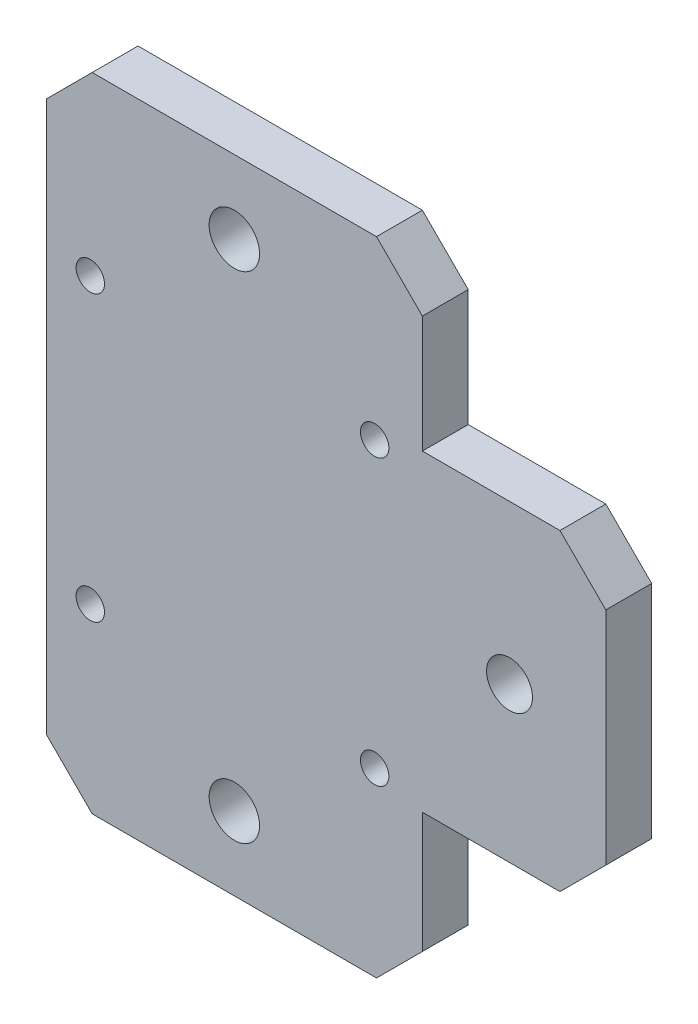
ISO-10303-21;
HEADER;
FILE_DESCRIPTION(('STEP AP214'),'2;1');
FILE_NAME('part.step','',(''),(''),'','','');
FILE_SCHEMA(('AUTOMOTIVE_DESIGN { 1 0 10303 214 1 1 1 1 }'));
ENDSEC;
DATA;
#1=APPLICATION_CONTEXT('core data for automotive mechanical design processes');
#2=APPLICATION_PROTOCOL_DEFINITION('international standard','automotive_design',2000,#1);
#3=PRODUCT_CONTEXT('',#1,'mechanical');
#4=PRODUCT('Part','Part','',(#3));
#5=PRODUCT_RELATED_PRODUCT_CATEGORY('part','',(#4));
#6=PRODUCT_DEFINITION_FORMATION('','',#4);
#7=PRODUCT_DEFINITION_CONTEXT('part definition',#1,'design');
#8=PRODUCT_DEFINITION('design','',#6,#7);
#9=PRODUCT_DEFINITION_SHAPE('','',#8);
#10=(LENGTH_UNIT() NAMED_UNIT(*) SI_UNIT(.MILLI.,.METRE.));
#11=(NAMED_UNIT(*) PLANE_ANGLE_UNIT() SI_UNIT($,.RADIAN.));
#12=(NAMED_UNIT(*) SI_UNIT($,.STERADIAN.) SOLID_ANGLE_UNIT());
#13=UNCERTAINTY_MEASURE_WITH_UNIT(LENGTH_MEASURE(1.E-05),#10,'distance_accuracy_value','');
#14=(GEOMETRIC_REPRESENTATION_CONTEXT(3) GLOBAL_UNCERTAINTY_ASSIGNED_CONTEXT((#13)) GLOBAL_UNIT_ASSIGNED_CONTEXT((#10,
#11,#12)) REPRESENTATION_CONTEXT('',''));
#15=CARTESIAN_POINT('',(0.,0.,0.));
#16=DIRECTION('',(0.,0.,1.));
#17=DIRECTION('',(1.,0.,0.));
#18=AXIS2_PLACEMENT_3D('',#15,#16,#17);
#19=CARTESIAN_POINT('',(20.5,-35.,5.));
#20=DIRECTION('',(-1.,0.,0.));
#21=DIRECTION('',(0.,0.,1.));
#22=AXIS2_PLACEMENT_3D('',#19,#20,#21);
#23=PLANE('',#22);
#24=DIRECTION('',(0.,0.,1.));
#25=VECTOR('',#24,1.);
#26=CARTESIAN_POINT('',(20.5,17.2547781569966,0.));
#27=LINE('',#26,#25);
#28=CARTESIAN_POINT('',(20.5,17.2547781569966,0.));
#29=VERTEX_POINT('',#28);
#30=CARTESIAN_POINT('',(20.5,17.2547781569966,5.));
#31=VERTEX_POINT('',#30);
#32=EDGE_CURVE('E149',#29,#31,#27,.T.);
#33=ORIENTED_EDGE('',*,*,#32,.F.);
#34=DIRECTION('',(0.,1.,0.));
#35=VECTOR('',#34,1.);
#36=CARTESIAN_POINT('',(20.5,-35.,0.));
#37=LINE('',#36,#35);
#38=CARTESIAN_POINT('',(20.5,30.,0.));
#39=VERTEX_POINT('',#38);
#40=EDGE_CURVE('E165',#29,#39,#37,.T.);
#41=ORIENTED_EDGE('',*,*,#40,.T.);
#42=DIRECTION('',(0.,0.,1.));
#43=VECTOR('',#42,1.);
#44=CARTESIAN_POINT('',(20.5,30.,5.));
#45=LINE('',#44,#43);
#46=CARTESIAN_POINT('',(20.5,30.,5.));
#47=VERTEX_POINT('',#46);
#48=EDGE_CURVE('E202',#39,#47,#45,.T.);
#49=ORIENTED_EDGE('',*,*,#48,.T.);
#50=DIRECTION('',(0.,1.,0.));
#51=VECTOR('',#50,1.);
#52=CARTESIAN_POINT('',(20.5,-35.,5.));
#53=LINE('',#52,#51);
#54=EDGE_CURVE('E289',#31,#47,#53,.T.);
#55=ORIENTED_EDGE('',*,*,#54,.F.);
#56=EDGE_LOOP('',(#33,#41,#49,#55));
#57=FACE_BOUND('',#56,.T.);
#58=ADVANCED_FACE('F36',(#57),#23,.F.);
#59=CARTESIAN_POINT('',(0.,0.,5.));
#60=DIRECTION('',(0.,0.,1.));
#61=DIRECTION('',(1.,0.,0.));
#62=AXIS2_PLACEMENT_3D('',#59,#60,#61);
#63=PLANE('',#62);
#64=CARTESIAN_POINT('',(0.,-27.,5.));
#65=DIRECTION('',(0.,0.,1.));
#66=DIRECTION('',(1.,0.,0.));
#67=AXIS2_PLACEMENT_3D('',#64,#65,#66);
#68=CIRCLE('',#67,2.75);
#69=CARTESIAN_POINT('',(2.75,-27.,5.));
#70=VERTEX_POINT('',#69);
#71=EDGE_CURVE('E254',#70,#70,#68,.T.);
#72=ORIENTED_EDGE('',*,*,#71,.F.);
#73=EDGE_LOOP('',(#72));
#74=FACE_BOUND('',#73,.T.);
#75=CARTESIAN_POINT('',(15.2952218430034,15.7047781569966,5.));
#76=DIRECTION('',(0.,0.,1.));
#77=DIRECTION('',(1.,0.,0.));
#78=AXIS2_PLACEMENT_3D('',#75,#76,#77);
#79=CIRCLE('',#78,1.55000000000004);
#80=CARTESIAN_POINT('',(16.8452218430034,15.7047781569966,5.));
#81=VERTEX_POINT('',#80);
#82=EDGE_CURVE('E266',#81,#81,#79,.T.);
#83=ORIENTED_EDGE('',*,*,#82,.F.);
#84=EDGE_LOOP('',(#83));
#85=FACE_BOUND('',#84,.T.);
#86=CARTESIAN_POINT('',(-15.7047781569966,-15.2952218430034,5.));
#87=DIRECTION('',(0.,0.,1.));
#88=DIRECTION('',(1.,0.,0.));
#89=AXIS2_PLACEMENT_3D('',#86,#87,#88);
#90=CIRCLE('',#89,1.55000000000002);
#91=CARTESIAN_POINT('',(-14.1547781569966,-15.2952218430034,5.));
#92=VERTEX_POINT('',#91);
#93=EDGE_CURVE('E278',#92,#92,#90,.T.);
#94=ORIENTED_EDGE('',*,*,#93,.F.);
#95=EDGE_LOOP('',(#94));
#96=FACE_BOUND('',#95,.T.);
#97=DIRECTION('',(1.,0.,0.));
#98=VECTOR('',#97,1.);
#99=CARTESIAN_POINT('',(20.5,-16.8452218430034,5.));
#100=LINE('',#99,#98);
#101=CARTESIAN_POINT('',(20.5,-16.8452218430034,5.));
#102=VERTEX_POINT('',#101);
#103=CARTESIAN_POINT('',(35.5,-16.8452218430034,5.));
#104=VERTEX_POINT('',#103);
#105=EDGE_CURVE('E144',#102,#104,#100,.T.);
#106=ORIENTED_EDGE('',*,*,#105,.T.);
#107=DIRECTION('',(-0.707106781186546,-0.707106781186549,0.));
#108=VECTOR('',#107,1.);
#109=CARTESIAN_POINT('',(26.1726109215018,-26.1726109215017,5.));
#110=LINE('',#109,#108);
#111=CARTESIAN_POINT('',(40.5,-11.8452218430034,5.));
#112=VERTEX_POINT('',#111);
#113=EDGE_CURVE('E215',#104,#112,#110,.F.);
#114=ORIENTED_EDGE('',*,*,#113,.T.);
#115=DIRECTION('',(0.,1.,0.));
#116=VECTOR('',#115,1.);
#117=CARTESIAN_POINT('',(40.5,17.2547781569966,5.));
#118=LINE('',#117,#116);
#119=CARTESIAN_POINT('',(40.5,12.2547781569966,5.));
#120=VERTEX_POINT('',#119);
#121=EDGE_CURVE('E228',#112,#120,#118,.T.);
#122=ORIENTED_EDGE('',*,*,#121,.T.);
#123=DIRECTION('',(0.707106781186549,-0.707106781186546,0.));
#124=VECTOR('',#123,1.);
#125=CARTESIAN_POINT('',(26.3773890784982,26.3773890784984,5.));
#126=LINE('',#125,#124);
#127=CARTESIAN_POINT('',(35.5,17.2547781569966,5.));
#128=VERTEX_POINT('',#127);
#129=EDGE_CURVE('E213',#120,#128,#126,.F.);
#130=ORIENTED_EDGE('',*,*,#129,.T.);
#131=DIRECTION('',(-1.,0.,0.));
#132=VECTOR('',#131,1.);
#133=CARTESIAN_POINT('',(20.5,17.2547781569966,5.));
#134=LINE('',#133,#132);
#135=EDGE_CURVE('E158',#128,#31,#134,.T.);
#136=ORIENTED_EDGE('',*,*,#135,.T.);
#137=ORIENTED_EDGE('',*,*,#54,.T.);
#138=DIRECTION('',(0.707106781186545,-0.70710678118655,0.));
#139=VECTOR('',#138,1.);
#140=CARTESIAN_POINT('',(25.2500000000001,25.2499999999999,5.));
#141=LINE('',#140,#139);
#142=CARTESIAN_POINT('',(15.5,35.,5.));
#143=VERTEX_POINT('',#142);
#144=EDGE_CURVE('E194',#47,#143,#141,.F.);
#145=ORIENTED_EDGE('',*,*,#144,.T.);
#146=DIRECTION('',(-1.,0.,0.));
#147=VECTOR('',#146,1.);
#148=CARTESIAN_POINT('',(20.5,35.,5.));
#149=LINE('',#148,#147);
#150=CARTESIAN_POINT('',(-15.5,35.,5.));
#151=VERTEX_POINT('',#150);
#152=EDGE_CURVE('E177',#143,#151,#149,.T.);
#153=ORIENTED_EDGE('',*,*,#152,.T.);
#154=DIRECTION('',(0.707106781186548,0.707106781186548,0.));
#155=VECTOR('',#154,1.);
#156=CARTESIAN_POINT('',(-25.25,25.25,5.));
#157=LINE('',#156,#155);
#158=CARTESIAN_POINT('',(-20.5,30.,5.));
#159=VERTEX_POINT('',#158);
#160=EDGE_CURVE('E196',#151,#159,#157,.F.);
#161=ORIENTED_EDGE('',*,*,#160,.T.);
#162=DIRECTION('',(0.,-1.,0.));
#163=VECTOR('',#162,1.);
#164=CARTESIAN_POINT('',(-20.5,-35.,5.));
#165=LINE('',#164,#163);
#166=CARTESIAN_POINT('',(-20.5,-30.,5.));
#167=VERTEX_POINT('',#166);
#168=EDGE_CURVE('E168',#159,#167,#165,.T.);
#169=ORIENTED_EDGE('',*,*,#168,.T.);
#170=DIRECTION('',(-0.707106781186546,0.707106781186549,0.));
#171=VECTOR('',#170,1.);
#172=CARTESIAN_POINT('',(-25.25,-25.2499999999999,5.));
#173=LINE('',#172,#171);
#174=CARTESIAN_POINT('',(-15.5,-35.,5.));
#175=VERTEX_POINT('',#174);
#176=EDGE_CURVE('E200',#167,#175,#173,.F.);
#177=ORIENTED_EDGE('',*,*,#176,.T.);
#178=DIRECTION('',(1.,0.,0.));
#179=VECTOR('',#178,1.);
#180=CARTESIAN_POINT('',(20.5,-35.,5.));
#181=LINE('',#180,#179);
#182=CARTESIAN_POINT('',(15.5,-35.,5.));
#183=VERTEX_POINT('',#182);
#184=EDGE_CURVE('E286',#175,#183,#181,.T.);
#185=ORIENTED_EDGE('',*,*,#184,.T.);
#186=DIRECTION('',(-0.707106781186548,-0.707106781186547,0.));
#187=VECTOR('',#186,1.);
#188=CARTESIAN_POINT('',(25.25,-25.25,5.));
#189=LINE('',#188,#187);
#190=CARTESIAN_POINT('',(20.5,-30.,5.));
#191=VERTEX_POINT('',#190);
#192=EDGE_CURVE('E198',#183,#191,#189,.F.);
#193=ORIENTED_EDGE('',*,*,#192,.T.);
#194=EDGE_CURVE('E235',#191,#102,#53,.T.);
#195=ORIENTED_EDGE('',*,*,#194,.T.);
#196=EDGE_LOOP('',(#106,#114,#122,#130,#136,#137,#145,#153,#161,#169,#177,#185,#193,#195));
#197=FACE_BOUND('',#196,.T.);
#198=CARTESIAN_POINT('',(15.2952218430034,-15.2952218430034,5.));
#199=DIRECTION('',(0.,0.,1.));
#200=DIRECTION('',(1.,0.,0.));
#201=AXIS2_PLACEMENT_3D('',#198,#199,#200);
#202=CIRCLE('',#201,1.55000000000002);
#203=CARTESIAN_POINT('',(16.8452218430034,-15.2952218430034,5.));
#204=VERTEX_POINT('',#203);
#205=EDGE_CURVE('E272',#204,#204,#202,.T.);
#206=ORIENTED_EDGE('',*,*,#205,.F.);
#207=EDGE_LOOP('',(#206));
#208=FACE_BOUND('',#207,.T.);
#209=CARTESIAN_POINT('',(-15.7047781569966,15.7047781569966,5.));
#210=DIRECTION('',(0.,0.,1.));
#211=DIRECTION('',(1.,0.,0.));
#212=AXIS2_PLACEMENT_3D('',#209,#210,#211);
#213=CIRCLE('',#212,1.55000000000004);
#214=CARTESIAN_POINT('',(-14.1547781569966,15.7047781569966,5.));
#215=VERTEX_POINT('',#214);
#216=EDGE_CURVE('E260',#215,#215,#213,.T.);
#217=ORIENTED_EDGE('',*,*,#216,.F.);
#218=EDGE_LOOP('',(#217));
#219=FACE_BOUND('',#218,.T.);
#220=CARTESIAN_POINT('',(0.,27.,5.));
#221=DIRECTION('',(0.,0.,1.));
#222=DIRECTION('',(1.,0.,0.));
#223=AXIS2_PLACEMENT_3D('',#220,#221,#222);
#224=CIRCLE('',#223,2.75);
#225=CARTESIAN_POINT('',(2.75,27.,5.));
#226=VERTEX_POINT('',#225);
#227=EDGE_CURVE('E248',#226,#226,#224,.T.);
#228=ORIENTED_EDGE('',*,*,#227,.F.);
#229=EDGE_LOOP('',(#228));
#230=FACE_BOUND('',#229,.T.);
#231=CARTESIAN_POINT('',(30.,0.,5.));
#232=DIRECTION('',(0.,0.,1.));
#233=DIRECTION('',(1.,0.,0.));
#234=AXIS2_PLACEMENT_3D('',#231,#232,#233);
#235=CIRCLE('',#234,2.5);
#236=CARTESIAN_POINT('',(32.5,0.,5.));
#237=VERTEX_POINT('',#236);
#238=EDGE_CURVE('E240',#237,#237,#235,.T.);
#239=ORIENTED_EDGE('',*,*,#238,.F.);
#240=EDGE_LOOP('',(#239));
#241=FACE_BOUND('',#240,.T.);
#242=ADVANCED_FACE('F233',(#74,#85,#96,#197,#208,#219,#230,#241),#63,.T.);
#243=CARTESIAN_POINT('',(0.,0.,0.));
#244=DIRECTION('',(0.,0.,1.));
#245=DIRECTION('',(1.,0.,0.));
#246=AXIS2_PLACEMENT_3D('',#243,#244,#245);
#247=PLANE('',#246);
#248=DIRECTION('',(0.,1.,0.));
#249=VECTOR('',#248,1.);
#250=CARTESIAN_POINT('',(40.5,17.2547781569966,0.));
#251=LINE('',#250,#249);
#252=CARTESIAN_POINT('',(40.5,-11.8452218430034,0.));
#253=VERTEX_POINT('',#252);
#254=CARTESIAN_POINT('',(40.5,12.2547781569966,0.));
#255=VERTEX_POINT('',#254);
#256=EDGE_CURVE('E157',#253,#255,#251,.T.);
#257=ORIENTED_EDGE('',*,*,#256,.F.);
#258=DIRECTION('',(0.707106781186546,0.707106781186549,0.));
#259=VECTOR('',#258,1.);
#260=CARTESIAN_POINT('',(35.5,-16.8452218430034,0.));
#261=LINE('',#260,#259);
#262=CARTESIAN_POINT('',(35.5,-16.8452218430034,0.));
#263=VERTEX_POINT('',#262);
#264=EDGE_CURVE('E44',#253,#263,#261,.F.);
#265=ORIENTED_EDGE('',*,*,#264,.T.);
#266=DIRECTION('',(1.,0.,0.));
#267=VECTOR('',#266,1.);
#268=CARTESIAN_POINT('',(20.5,-16.8452218430034,0.));
#269=LINE('',#268,#267);
#270=CARTESIAN_POINT('',(20.5,-16.8452218430034,0.));
#271=VERTEX_POINT('',#270);
#272=EDGE_CURVE('E141',#271,#263,#269,.T.);
#273=ORIENTED_EDGE('',*,*,#272,.F.);
#274=CARTESIAN_POINT('',(20.5,-30.,0.));
#275=VERTEX_POINT('',#274);
#276=EDGE_CURVE('E155',#275,#271,#37,.T.);
#277=ORIENTED_EDGE('',*,*,#276,.F.);
#278=DIRECTION('',(0.707106781186548,0.707106781186547,0.));
#279=VECTOR('',#278,1.);
#280=CARTESIAN_POINT('',(20.5,-30.,0.));
#281=LINE('',#280,#279);
#282=CARTESIAN_POINT('',(15.5,-35.,0.));
#283=VERTEX_POINT('',#282);
#284=EDGE_CURVE('E185',#275,#283,#281,.F.);
#285=ORIENTED_EDGE('',*,*,#284,.T.);
#286=DIRECTION('',(1.,0.,0.));
#287=VECTOR('',#286,1.);
#288=CARTESIAN_POINT('',(20.5,-35.,0.));
#289=LINE('',#288,#287);
#290=CARTESIAN_POINT('',(-15.5,-35.,0.));
#291=VERTEX_POINT('',#290);
#292=EDGE_CURVE('E170',#291,#283,#289,.T.);
#293=ORIENTED_EDGE('',*,*,#292,.F.);
#294=DIRECTION('',(0.707106781186546,-0.707106781186549,0.));
#295=VECTOR('',#294,1.);
#296=CARTESIAN_POINT('',(-15.5,-35.,0.));
#297=LINE('',#296,#295);
#298=CARTESIAN_POINT('',(-20.5,-30.,0.));
#299=VERTEX_POINT('',#298);
#300=EDGE_CURVE('E187',#291,#299,#297,.F.);
#301=ORIENTED_EDGE('',*,*,#300,.T.);
#302=DIRECTION('',(0.,-1.,0.));
#303=VECTOR('',#302,1.);
#304=CARTESIAN_POINT('',(-20.5,-35.,0.));
#305=LINE('',#304,#303);
#306=CARTESIAN_POINT('',(-20.5,30.,0.));
#307=VERTEX_POINT('',#306);
#308=EDGE_CURVE('E281',#307,#299,#305,.T.);
#309=ORIENTED_EDGE('',*,*,#308,.F.);
#310=DIRECTION('',(-0.707106781186548,-0.707106781186548,0.));
#311=VECTOR('',#310,1.);
#312=CARTESIAN_POINT('',(-20.5,30.,0.));
#313=LINE('',#312,#311);
#314=CARTESIAN_POINT('',(-15.5,35.,0.));
#315=VERTEX_POINT('',#314);
#316=EDGE_CURVE('E183',#307,#315,#313,.F.);
#317=ORIENTED_EDGE('',*,*,#316,.T.);
#318=DIRECTION('',(-1.,0.,0.));
#319=VECTOR('',#318,1.);
#320=CARTESIAN_POINT('',(20.5,35.,0.));
#321=LINE('',#320,#319);
#322=CARTESIAN_POINT('',(15.5,35.,0.));
#323=VERTEX_POINT('',#322);
#324=EDGE_CURVE('E164',#323,#315,#321,.T.);
#325=ORIENTED_EDGE('',*,*,#324,.F.);
#326=DIRECTION('',(-0.707106781186545,0.70710678118655,0.));
#327=VECTOR('',#326,1.);
#328=CARTESIAN_POINT('',(15.5,35.,0.));
#329=LINE('',#328,#327);
#330=EDGE_CURVE('E180',#323,#39,#329,.F.);
#331=ORIENTED_EDGE('',*,*,#330,.T.);
#332=ORIENTED_EDGE('',*,*,#40,.F.);
#333=DIRECTION('',(-1.,0.,0.));
#334=VECTOR('',#333,1.);
#335=CARTESIAN_POINT('',(20.5,17.2547781569966,0.));
#336=LINE('',#335,#334);
#337=CARTESIAN_POINT('',(35.5,17.2547781569966,0.));
#338=VERTEX_POINT('',#337);
#339=EDGE_CURVE('E150',#338,#29,#336,.T.);
#340=ORIENTED_EDGE('',*,*,#339,.F.);
#341=DIRECTION('',(-0.707106781186549,0.707106781186546,0.));
#342=VECTOR('',#341,1.);
#343=CARTESIAN_POINT('',(40.5,12.2547781569966,0.));
#344=LINE('',#343,#342);
#345=EDGE_CURVE('E56',#338,#255,#344,.F.);
#346=ORIENTED_EDGE('',*,*,#345,.T.);
#347=EDGE_LOOP('',(#257,#265,#273,#277,#285,#293,#301,#309,#317,#325,#331,#332,#340,#346));
#348=FACE_BOUND('',#347,.T.);
#349=CARTESIAN_POINT('',(-15.7047781569966,-15.2952218430034,0.));
#350=DIRECTION('',(0.,0.,1.));
#351=DIRECTION('',(1.,0.,0.));
#352=AXIS2_PLACEMENT_3D('',#349,#350,#351);
#353=CIRCLE('',#352,1.55000000000002);
#354=CARTESIAN_POINT('',(-14.1547781569966,-15.2952218430034,0.));
#355=VERTEX_POINT('',#354);
#356=EDGE_CURVE('E275',#355,#355,#353,.T.);
#357=ORIENTED_EDGE('',*,*,#356,.T.);
#358=EDGE_LOOP('',(#357));
#359=FACE_BOUND('',#358,.T.);
#360=CARTESIAN_POINT('',(15.2952218430034,-15.2952218430034,0.));
#361=DIRECTION('',(0.,0.,1.));
#362=DIRECTION('',(1.,0.,0.));
#363=AXIS2_PLACEMENT_3D('',#360,#361,#362);
#364=CIRCLE('',#363,1.55000000000002);
#365=CARTESIAN_POINT('',(16.8452218430034,-15.2952218430034,0.));
#366=VERTEX_POINT('',#365);
#367=EDGE_CURVE('E269',#366,#366,#364,.T.);
#368=ORIENTED_EDGE('',*,*,#367,.T.);
#369=EDGE_LOOP('',(#368));
#370=FACE_BOUND('',#369,.T.);
#371=CARTESIAN_POINT('',(15.2952218430034,15.7047781569966,0.));
#372=DIRECTION('',(0.,0.,1.));
#373=DIRECTION('',(1.,0.,0.));
#374=AXIS2_PLACEMENT_3D('',#371,#372,#373);
#375=CIRCLE('',#374,1.55000000000004);
#376=CARTESIAN_POINT('',(16.8452218430034,15.7047781569966,0.));
#377=VERTEX_POINT('',#376);
#378=EDGE_CURVE('E263',#377,#377,#375,.T.);
#379=ORIENTED_EDGE('',*,*,#378,.T.);
#380=EDGE_LOOP('',(#379));
#381=FACE_BOUND('',#380,.T.);
#382=CARTESIAN_POINT('',(-15.7047781569966,15.7047781569966,0.));
#383=DIRECTION('',(0.,0.,1.));
#384=DIRECTION('',(1.,0.,0.));
#385=AXIS2_PLACEMENT_3D('',#382,#383,#384);
#386=CIRCLE('',#385,1.55000000000004);
#387=CARTESIAN_POINT('',(-14.1547781569966,15.7047781569966,0.));
#388=VERTEX_POINT('',#387);
#389=EDGE_CURVE('E257',#388,#388,#386,.T.);
#390=ORIENTED_EDGE('',*,*,#389,.T.);
#391=EDGE_LOOP('',(#390));
#392=FACE_BOUND('',#391,.T.);
#393=CARTESIAN_POINT('',(0.,-27.,0.));
#394=DIRECTION('',(0.,0.,1.));
#395=DIRECTION('',(1.,0.,0.));
#396=AXIS2_PLACEMENT_3D('',#393,#394,#395);
#397=CIRCLE('',#396,2.75);
#398=CARTESIAN_POINT('',(2.75,-27.,0.));
#399=VERTEX_POINT('',#398);
#400=EDGE_CURVE('E251',#399,#399,#397,.T.);
#401=ORIENTED_EDGE('',*,*,#400,.T.);
#402=EDGE_LOOP('',(#401));
#403=FACE_BOUND('',#402,.T.);
#404=CARTESIAN_POINT('',(0.,27.,0.));
#405=DIRECTION('',(0.,0.,1.));
#406=DIRECTION('',(1.,0.,0.));
#407=AXIS2_PLACEMENT_3D('',#404,#405,#406);
#408=CIRCLE('',#407,2.75);
#409=CARTESIAN_POINT('',(2.75,27.,0.));
#410=VERTEX_POINT('',#409);
#411=EDGE_CURVE('E246',#410,#410,#408,.T.);
#412=ORIENTED_EDGE('',*,*,#411,.T.);
#413=EDGE_LOOP('',(#412));
#414=FACE_BOUND('',#413,.T.);
#415=CARTESIAN_POINT('',(30.,0.,0.));
#416=DIRECTION('',(0.,0.,1.));
#417=DIRECTION('',(1.,0.,0.));
#418=AXIS2_PLACEMENT_3D('',#415,#416,#417);
#419=CIRCLE('',#418,2.5);
#420=CARTESIAN_POINT('',(32.5,0.,0.));
#421=VERTEX_POINT('',#420);
#422=EDGE_CURVE('E236',#421,#421,#419,.T.);
#423=ORIENTED_EDGE('',*,*,#422,.T.);
#424=EDGE_LOOP('',(#423));
#425=FACE_BOUND('',#424,.T.);
#426=ADVANCED_FACE('F153',(#348,#359,#370,#381,#392,#403,#414,#425),#247,.F.);
#427=CARTESIAN_POINT('',(-20.5,-35.,5.));
#428=DIRECTION('',(1.,0.,0.));
#429=DIRECTION('',(0.,0.,-1.));
#430=AXIS2_PLACEMENT_3D('',#427,#428,#429);
#431=PLANE('',#430);
#432=ORIENTED_EDGE('',*,*,#308,.T.);
#433=DIRECTION('',(0.,0.,1.));
#434=VECTOR('',#433,1.);
#435=CARTESIAN_POINT('',(-20.5,-30.,5.));
#436=LINE('',#435,#434);
#437=EDGE_CURVE('E192',#299,#167,#436,.T.);
#438=ORIENTED_EDGE('',*,*,#437,.T.);
#439=ORIENTED_EDGE('',*,*,#168,.F.);
#440=DIRECTION('',(0.,0.,-1.));
#441=VECTOR('',#440,1.);
#442=CARTESIAN_POINT('',(-20.5,30.,5.));
#443=LINE('',#442,#441);
#444=EDGE_CURVE('E189',#159,#307,#443,.T.);
#445=ORIENTED_EDGE('',*,*,#444,.T.);
#446=EDGE_LOOP('',(#432,#438,#439,#445));
#447=FACE_BOUND('',#446,.T.);
#448=ADVANCED_FACE('F320',(#447),#431,.F.);
#449=CARTESIAN_POINT('',(20.5,-35.,5.));
#450=DIRECTION('',(0.,1.,0.));
#451=DIRECTION('',(-1.,0.,0.));
#452=AXIS2_PLACEMENT_3D('',#449,#450,#451);
#453=PLANE('',#452);
#454=ORIENTED_EDGE('',*,*,#184,.F.);
#455=DIRECTION('',(0.,0.,-1.));
#456=VECTOR('',#455,1.);
#457=CARTESIAN_POINT('',(-15.5,-35.,5.));
#458=LINE('',#457,#456);
#459=EDGE_CURVE('E176',#175,#291,#458,.T.);
#460=ORIENTED_EDGE('',*,*,#459,.T.);
#461=ORIENTED_EDGE('',*,*,#292,.T.);
#462=DIRECTION('',(0.,0.,1.));
#463=VECTOR('',#462,1.);
#464=CARTESIAN_POINT('',(15.5,-35.,5.));
#465=LINE('',#464,#463);
#466=EDGE_CURVE('E174',#283,#183,#465,.T.);
#467=ORIENTED_EDGE('',*,*,#466,.T.);
#468=EDGE_LOOP('',(#454,#460,#461,#467));
#469=FACE_BOUND('',#468,.T.);
#470=ADVANCED_FACE('F301',(#469),#453,.F.);
#471=ORIENTED_EDGE('',*,*,#276,.T.);
#472=DIRECTION('',(0.,0.,1.));
#473=VECTOR('',#472,1.);
#474=CARTESIAN_POINT('',(20.5,-16.8452218430034,0.));
#475=LINE('',#474,#473);
#476=EDGE_CURVE('E137',#271,#102,#475,.T.);
#477=ORIENTED_EDGE('',*,*,#476,.T.);
#478=ORIENTED_EDGE('',*,*,#194,.F.);
#479=DIRECTION('',(0.,0.,-1.));
#480=VECTOR('',#479,1.);
#481=CARTESIAN_POINT('',(20.5,-30.,5.));
#482=LINE('',#481,#480);
#483=EDGE_CURVE('E163',#191,#275,#482,.T.);
#484=ORIENTED_EDGE('',*,*,#483,.T.);
#485=EDGE_LOOP('',(#471,#477,#478,#484));
#486=FACE_BOUND('',#485,.T.);
#487=ADVANCED_FACE('F161',(#486),#23,.F.);
#488=CARTESIAN_POINT('',(20.5,35.,5.));
#489=DIRECTION('',(0.,-1.,0.));
#490=DIRECTION('',(1.,0.,0.));
#491=AXIS2_PLACEMENT_3D('',#488,#489,#490);
#492=PLANE('',#491);
#493=ORIENTED_EDGE('',*,*,#324,.T.);
#494=DIRECTION('',(0.,0.,1.));
#495=VECTOR('',#494,1.);
#496=CARTESIAN_POINT('',(-15.5,35.,5.));
#497=LINE('',#496,#495);
#498=EDGE_CURVE('E209',#315,#151,#497,.T.);
#499=ORIENTED_EDGE('',*,*,#498,.T.);
#500=ORIENTED_EDGE('',*,*,#152,.F.);
#501=DIRECTION('',(0.,0.,-1.));
#502=VECTOR('',#501,1.);
#503=CARTESIAN_POINT('',(15.5,35.,5.));
#504=LINE('',#503,#502);
#505=EDGE_CURVE('E206',#143,#323,#504,.T.);
#506=ORIENTED_EDGE('',*,*,#505,.T.);
#507=EDGE_LOOP('',(#493,#499,#500,#506));
#508=FACE_BOUND('',#507,.T.);
#509=ADVANCED_FACE('F314',(#508),#492,.F.);
#510=CARTESIAN_POINT('',(-15.7047781569966,-15.2952218430034,5.));
#511=DIRECTION('',(0.,0.,-1.));
#512=DIRECTION('',(-1.,0.,0.));
#513=AXIS2_PLACEMENT_3D('',#510,#511,#512);
#514=CYLINDRICAL_SURFACE('',#513,1.55000000000002);
#515=ORIENTED_EDGE('',*,*,#93,.T.);
#516=EDGE_LOOP('',(#515));
#517=FACE_BOUND('',#516,.T.);
#518=ORIENTED_EDGE('',*,*,#356,.F.);
#519=EDGE_LOOP('',(#518));
#520=FACE_BOUND('',#519,.T.);
#521=ADVANCED_FACE('F344',(#517,#520),#514,.F.);
#522=CARTESIAN_POINT('',(15.2952218430034,-15.2952218430034,5.));
#523=DIRECTION('',(0.,0.,-1.));
#524=DIRECTION('',(-1.,0.,0.));
#525=AXIS2_PLACEMENT_3D('',#522,#523,#524);
#526=CYLINDRICAL_SURFACE('',#525,1.55000000000002);
#527=ORIENTED_EDGE('',*,*,#205,.T.);
#528=EDGE_LOOP('',(#527));
#529=FACE_BOUND('',#528,.T.);
#530=ORIENTED_EDGE('',*,*,#367,.F.);
#531=EDGE_LOOP('',(#530));
#532=FACE_BOUND('',#531,.T.);
#533=ADVANCED_FACE('F348',(#529,#532),#526,.F.);
#534=CARTESIAN_POINT('',(15.2952218430034,15.7047781569966,5.));
#535=DIRECTION('',(0.,0.,-1.));
#536=DIRECTION('',(-1.,0.,0.));
#537=AXIS2_PLACEMENT_3D('',#534,#535,#536);
#538=CYLINDRICAL_SURFACE('',#537,1.55000000000004);
#539=ORIENTED_EDGE('',*,*,#82,.T.);
#540=EDGE_LOOP('',(#539));
#541=FACE_BOUND('',#540,.T.);
#542=ORIENTED_EDGE('',*,*,#378,.F.);
#543=EDGE_LOOP('',(#542));
#544=FACE_BOUND('',#543,.T.);
#545=ADVANCED_FACE('F354',(#541,#544),#538,.F.);
#546=CARTESIAN_POINT('',(-15.7047781569966,15.7047781569966,5.));
#547=DIRECTION('',(0.,0.,-1.));
#548=DIRECTION('',(-1.,0.,0.));
#549=AXIS2_PLACEMENT_3D('',#546,#547,#548);
#550=CYLINDRICAL_SURFACE('',#549,1.55000000000004);
#551=ORIENTED_EDGE('',*,*,#216,.T.);
#552=EDGE_LOOP('',(#551));
#553=FACE_BOUND('',#552,.T.);
#554=ORIENTED_EDGE('',*,*,#389,.F.);
#555=EDGE_LOOP('',(#554));
#556=FACE_BOUND('',#555,.T.);
#557=ADVANCED_FACE('F358',(#553,#556),#550,.F.);
#558=CARTESIAN_POINT('',(0.,-27.,5.));
#559=DIRECTION('',(0.,0.,-1.));
#560=DIRECTION('',(-1.,0.,0.));
#561=AXIS2_PLACEMENT_3D('',#558,#559,#560);
#562=CYLINDRICAL_SURFACE('',#561,2.75);
#563=ORIENTED_EDGE('',*,*,#71,.T.);
#564=EDGE_LOOP('',(#563));
#565=FACE_BOUND('',#564,.T.);
#566=ORIENTED_EDGE('',*,*,#400,.F.);
#567=EDGE_LOOP('',(#566));
#568=FACE_BOUND('',#567,.T.);
#569=ADVANCED_FACE('F362',(#565,#568),#562,.F.);
#570=CARTESIAN_POINT('',(0.,27.,5.));
#571=DIRECTION('',(0.,0.,-1.));
#572=DIRECTION('',(-1.,0.,0.));
#573=AXIS2_PLACEMENT_3D('',#570,#571,#572);
#574=CYLINDRICAL_SURFACE('',#573,2.75);
#575=ORIENTED_EDGE('',*,*,#227,.T.);
#576=EDGE_LOOP('',(#575));
#577=FACE_BOUND('',#576,.T.);
#578=ORIENTED_EDGE('',*,*,#411,.F.);
#579=EDGE_LOOP('',(#578));
#580=FACE_BOUND('',#579,.T.);
#581=ADVANCED_FACE('F366',(#577,#580),#574,.F.);
#582=CARTESIAN_POINT('',(-15.5,-35.,5.));
#583=DIRECTION('',(0.707106781186549,0.707106781186546,0.));
#584=DIRECTION('',(0.,0.,-1.));
#585=AXIS2_PLACEMENT_3D('',#582,#583,#584);
#586=PLANE('',#585);
#587=ORIENTED_EDGE('',*,*,#176,.F.);
#588=ORIENTED_EDGE('',*,*,#437,.F.);
#589=ORIENTED_EDGE('',*,*,#300,.F.);
#590=ORIENTED_EDGE('',*,*,#459,.F.);
#591=EDGE_LOOP('',(#587,#588,#589,#590));
#592=FACE_BOUND('',#591,.T.);
#593=ADVANCED_FACE('F308',(#592),#586,.F.);
#594=CARTESIAN_POINT('',(20.5,-30.,5.));
#595=DIRECTION('',(-0.707106781186547,0.707106781186548,0.));
#596=DIRECTION('',(0.,0.,-1.));
#597=AXIS2_PLACEMENT_3D('',#594,#595,#596);
#598=PLANE('',#597);
#599=ORIENTED_EDGE('',*,*,#192,.F.);
#600=ORIENTED_EDGE('',*,*,#466,.F.);
#601=ORIENTED_EDGE('',*,*,#284,.F.);
#602=ORIENTED_EDGE('',*,*,#483,.F.);
#603=EDGE_LOOP('',(#599,#600,#601,#602));
#604=FACE_BOUND('',#603,.T.);
#605=ADVANCED_FACE('F305',(#604),#598,.F.);
#606=CARTESIAN_POINT('',(-20.5,30.,5.));
#607=DIRECTION('',(0.707106781186547,-0.707106781186547,0.));
#608=DIRECTION('',(0.,0.,-1.));
#609=AXIS2_PLACEMENT_3D('',#606,#607,#608);
#610=PLANE('',#609);
#611=ORIENTED_EDGE('',*,*,#160,.F.);
#612=ORIENTED_EDGE('',*,*,#498,.F.);
#613=ORIENTED_EDGE('',*,*,#316,.F.);
#614=ORIENTED_EDGE('',*,*,#444,.F.);
#615=EDGE_LOOP('',(#611,#612,#613,#614));
#616=FACE_BOUND('',#615,.T.);
#617=ADVANCED_FACE('F318',(#616),#610,.F.);
#618=CARTESIAN_POINT('',(15.5,35.,5.));
#619=DIRECTION('',(-0.70710678118655,-0.707106781186545,0.));
#620=DIRECTION('',(0.,0.,-1.));
#621=AXIS2_PLACEMENT_3D('',#618,#619,#620);
#622=PLANE('',#621);
#623=ORIENTED_EDGE('',*,*,#144,.F.);
#624=ORIENTED_EDGE('',*,*,#48,.F.);
#625=ORIENTED_EDGE('',*,*,#330,.F.);
#626=ORIENTED_EDGE('',*,*,#505,.F.);
#627=EDGE_LOOP('',(#623,#624,#625,#626));
#628=FACE_BOUND('',#627,.T.);
#629=ADVANCED_FACE('F379',(#628),#622,.F.);
#630=CARTESIAN_POINT('',(20.5,17.2547781569966,0.));
#631=DIRECTION('',(0.,1.,0.));
#632=DIRECTION('',(0.,0.,1.));
#633=AXIS2_PLACEMENT_3D('',#630,#631,#632);
#634=PLANE('',#633);
#635=ORIENTED_EDGE('',*,*,#135,.F.);
#636=DIRECTION('',(0.,0.,-1.));
#637=VECTOR('',#636,1.);
#638=CARTESIAN_POINT('',(35.5,17.2547781569966,0.));
#639=LINE('',#638,#637);
#640=EDGE_CURVE('E11',#128,#338,#639,.T.);
#641=ORIENTED_EDGE('',*,*,#640,.T.);
#642=ORIENTED_EDGE('',*,*,#339,.T.);
#643=ORIENTED_EDGE('',*,*,#32,.T.);
#644=EDGE_LOOP('',(#635,#641,#642,#643));
#645=FACE_BOUND('',#644,.T.);
#646=ADVANCED_FACE('F376',(#645),#634,.T.);
#647=CARTESIAN_POINT('',(40.5,17.2547781569966,0.));
#648=DIRECTION('',(1.,0.,0.));
#649=DIRECTION('',(0.,0.,-1.));
#650=AXIS2_PLACEMENT_3D('',#647,#648,#649);
#651=PLANE('',#650);
#652=ORIENTED_EDGE('',*,*,#121,.F.);
#653=DIRECTION('',(0.,0.,-1.));
#654=VECTOR('',#653,1.);
#655=CARTESIAN_POINT('',(40.5,-11.8452218430034,0.));
#656=LINE('',#655,#654);
#657=EDGE_CURVE('E220',#112,#253,#656,.T.);
#658=ORIENTED_EDGE('',*,*,#657,.T.);
#659=ORIENTED_EDGE('',*,*,#256,.T.);
#660=DIRECTION('',(0.,0.,1.));
#661=VECTOR('',#660,1.);
#662=CARTESIAN_POINT('',(40.5,12.2547781569966,0.));
#663=LINE('',#662,#661);
#664=EDGE_CURVE('E217',#255,#120,#663,.T.);
#665=ORIENTED_EDGE('',*,*,#664,.T.);
#666=EDGE_LOOP('',(#652,#658,#659,#665));
#667=FACE_BOUND('',#666,.T.);
#668=ADVANCED_FACE('F225',(#667),#651,.T.);
#669=CARTESIAN_POINT('',(20.5,-16.8452218430034,0.));
#670=DIRECTION('',(0.,-1.,0.));
#671=DIRECTION('',(0.,0.,-1.));
#672=AXIS2_PLACEMENT_3D('',#669,#670,#671);
#673=PLANE('',#672);
#674=ORIENTED_EDGE('',*,*,#272,.T.);
#675=DIRECTION('',(0.,0.,1.));
#676=VECTOR('',#675,1.);
#677=CARTESIAN_POINT('',(35.5,-16.8452218430034,0.));
#678=LINE('',#677,#676);
#679=EDGE_CURVE('E211',#263,#104,#678,.T.);
#680=ORIENTED_EDGE('',*,*,#679,.T.);
#681=ORIENTED_EDGE('',*,*,#105,.F.);
#682=ORIENTED_EDGE('',*,*,#476,.F.);
#683=EDGE_LOOP('',(#674,#680,#681,#682));
#684=FACE_BOUND('',#683,.T.);
#685=ADVANCED_FACE('F139',(#684),#673,.T.);
#686=CARTESIAN_POINT('',(30.,0.,0.));
#687=DIRECTION('',(0.,0.,1.));
#688=DIRECTION('',(1.,0.,0.));
#689=AXIS2_PLACEMENT_3D('',#686,#687,#688);
#690=CYLINDRICAL_SURFACE('',#689,2.5);
#691=ORIENTED_EDGE('',*,*,#422,.F.);
#692=EDGE_LOOP('',(#691));
#693=FACE_BOUND('',#692,.T.);
#694=ORIENTED_EDGE('',*,*,#238,.T.);
#695=EDGE_LOOP('',(#694));
#696=FACE_BOUND('',#695,.T.);
#697=ADVANCED_FACE('F373',(#693,#696),#690,.F.);
#698=CARTESIAN_POINT('',(35.5,-16.8452218430034,0.));
#699=DIRECTION('',(-0.707106781186549,0.707106781186545,0.));
#700=DIRECTION('',(0.,0.,1.));
#701=AXIS2_PLACEMENT_3D('',#698,#699,#700);
#702=PLANE('',#701);
#703=ORIENTED_EDGE('',*,*,#264,.F.);
#704=ORIENTED_EDGE('',*,*,#657,.F.);
#705=ORIENTED_EDGE('',*,*,#113,.F.);
#706=ORIENTED_EDGE('',*,*,#679,.F.);
#707=EDGE_LOOP('',(#703,#704,#705,#706));
#708=FACE_BOUND('',#707,.T.);
#709=ADVANCED_FACE('F231',(#708),#702,.F.);
#710=CARTESIAN_POINT('',(40.5,12.2547781569966,0.));
#711=DIRECTION('',(-0.707106781186546,-0.707106781186549,0.));
#712=DIRECTION('',(0.,0.,1.));
#713=AXIS2_PLACEMENT_3D('',#710,#711,#712);
#714=PLANE('',#713);
#715=ORIENTED_EDGE('',*,*,#345,.F.);
#716=ORIENTED_EDGE('',*,*,#640,.F.);
#717=ORIENTED_EDGE('',*,*,#129,.F.);
#718=ORIENTED_EDGE('',*,*,#664,.F.);
#719=EDGE_LOOP('',(#715,#716,#717,#718));
#720=FACE_BOUND('',#719,.T.);
#721=ADVANCED_FACE('F38',(#720),#714,.F.);
#722=CLOSED_SHELL('',(#58,#242,#426,#448,#470,#487,#509,#521,#533,#545,#557,#569,#581,#593,#605,
#617,#629,#646,#668,#685,#697,#709,#721));
#723=MANIFOLD_SOLID_BREP('B2',#722);
#724=ADVANCED_BREP_SHAPE_REPRESENTATION('',(#18,#723),#14);
#725=SHAPE_DEFINITION_REPRESENTATION(#9,#724);
ENDSEC;
END-ISO-10303-21;
